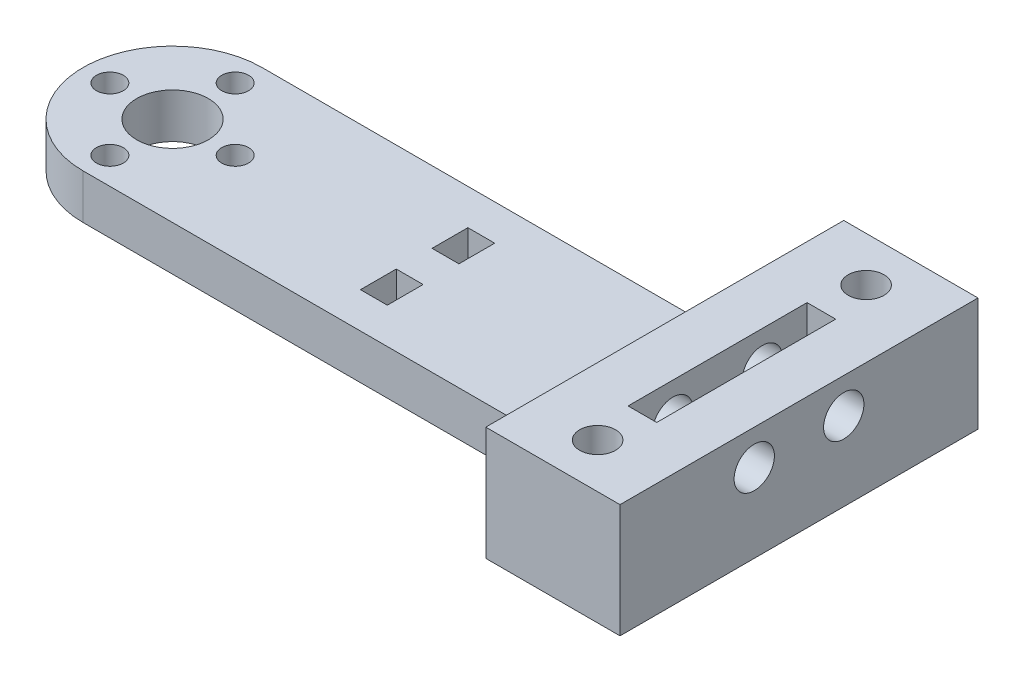
ISO-10303-21;
HEADER;
FILE_DESCRIPTION(('STEP AP214'),'2;1');
FILE_NAME('part.step','',(''),(''),'','','');
FILE_SCHEMA(('AUTOMOTIVE_DESIGN { 1 0 10303 214 1 1 1 1 }'));
ENDSEC;
DATA;
#1=APPLICATION_CONTEXT('core data for automotive mechanical design processes');
#2=APPLICATION_PROTOCOL_DEFINITION('international standard','automotive_design',2000,#1);
#3=PRODUCT_CONTEXT('',#1,'mechanical');
#4=PRODUCT('Part','Part','',(#3));
#5=PRODUCT_RELATED_PRODUCT_CATEGORY('part','',(#4));
#6=PRODUCT_DEFINITION_FORMATION('','',#4);
#7=PRODUCT_DEFINITION_CONTEXT('part definition',#1,'design');
#8=PRODUCT_DEFINITION('design','',#6,#7);
#9=PRODUCT_DEFINITION_SHAPE('','',#8);
#10=(LENGTH_UNIT() NAMED_UNIT(*) SI_UNIT(.MILLI.,.METRE.));
#11=(NAMED_UNIT(*) PLANE_ANGLE_UNIT() SI_UNIT($,.RADIAN.));
#12=(NAMED_UNIT(*) SI_UNIT($,.STERADIAN.) SOLID_ANGLE_UNIT());
#13=UNCERTAINTY_MEASURE_WITH_UNIT(LENGTH_MEASURE(1.E-05),#10,'distance_accuracy_value','');
#14=(GEOMETRIC_REPRESENTATION_CONTEXT(3) GLOBAL_UNCERTAINTY_ASSIGNED_CONTEXT((#13)) GLOBAL_UNIT_ASSIGNED_CONTEXT((#10,
#11,#12)) REPRESENTATION_CONTEXT('',''));
#15=CARTESIAN_POINT('',(0.,0.,0.));
#16=DIRECTION('',(0.,0.,1.));
#17=DIRECTION('',(1.,0.,0.));
#18=AXIS2_PLACEMENT_3D('',#15,#16,#17);
#19=CARTESIAN_POINT('',(8.8000166979834,8.80000000000001,-15.));
#20=DIRECTION('',(1.,0.,0.));
#21=DIRECTION('',(0.,0.,-1.));
#22=AXIS2_PLACEMENT_3D('',#19,#20,#21);
#23=CYLINDRICAL_SURFACE('',#22,2.25);
#24=CARTESIAN_POINT('',(22.9000166979834,8.80000000000001,-15.));
#25=DIRECTION('',(1.,0.,0.));
#26=DIRECTION('',(0.,0.,-1.));
#27=AXIS2_PLACEMENT_3D('',#24,#25,#26);
#28=CIRCLE('',#27,2.25);
#29=CARTESIAN_POINT('',(22.9000166979834,8.80000000000001,-17.25));
#30=VERTEX_POINT('',#29);
#31=EDGE_CURVE('E226',#30,#30,#28,.F.);
#32=ORIENTED_EDGE('',*,*,#31,.T.);
#33=EDGE_LOOP('',(#32));
#34=FACE_BOUND('',#33,.T.);
#35=CARTESIAN_POINT('',(28.8000166979834,8.80000000000001,-15.));
#36=DIRECTION('',(1.,0.,0.));
#37=DIRECTION('',(0.,0.,1.));
#38=AXIS2_PLACEMENT_3D('',#35,#36,#37);
#39=CIRCLE('',#38,2.25);
#40=CARTESIAN_POINT('',(28.8000166979834,8.80000000000001,-12.75));
#41=VERTEX_POINT('',#40);
#42=EDGE_CURVE('E269',#41,#41,#39,.T.);
#43=ORIENTED_EDGE('',*,*,#42,.T.);
#44=EDGE_LOOP('',(#43));
#45=FACE_BOUND('',#44,.T.);
#46=ADVANCED_FACE('F43',(#34,#45),#23,.F.);
#47=CARTESIAN_POINT('',(8.8000166979834,8.8,-4.99999999999999));
#48=DIRECTION('',(1.,0.,0.));
#49=DIRECTION('',(0.,0.,-1.));
#50=AXIS2_PLACEMENT_3D('',#47,#48,#49);
#51=CYLINDRICAL_SURFACE('',#50,2.25);
#52=CARTESIAN_POINT('',(22.9000166979834,8.8,-4.99999999999999));
#53=DIRECTION('',(1.,0.,0.));
#54=DIRECTION('',(0.,0.,-1.));
#55=AXIS2_PLACEMENT_3D('',#52,#53,#54);
#56=CIRCLE('',#55,2.25);
#57=CARTESIAN_POINT('',(22.9000166979834,8.8,-7.24999999999999));
#58=VERTEX_POINT('',#57);
#59=EDGE_CURVE('E47',#58,#58,#56,.F.);
#60=ORIENTED_EDGE('',*,*,#59,.T.);
#61=EDGE_LOOP('',(#60));
#62=FACE_BOUND('',#61,.T.);
#63=CARTESIAN_POINT('',(28.8000166979834,8.8,-4.99999999999999));
#64=DIRECTION('',(1.,0.,0.));
#65=DIRECTION('',(0.,0.,-1.));
#66=AXIS2_PLACEMENT_3D('',#63,#64,#65);
#67=CIRCLE('',#66,2.25);
#68=CARTESIAN_POINT('',(28.8000166979834,8.8,-7.24999999999999));
#69=VERTEX_POINT('',#68);
#70=EDGE_CURVE('E274',#69,#69,#67,.T.);
#71=ORIENTED_EDGE('',*,*,#70,.T.);
#72=EDGE_LOOP('',(#71));
#73=FACE_BOUND('',#72,.T.);
#74=ADVANCED_FACE('F420',(#62,#73),#51,.F.);
#75=CARTESIAN_POINT('',(-41.1999833020166,5.,-10.));
#76=DIRECTION('',(0.,1.,0.));
#77=DIRECTION('',(0.,0.,1.));
#78=AXIS2_PLACEMENT_3D('',#75,#76,#77);
#79=PLANE('',#78);
#80=DIRECTION('',(0.,0.,1.));
#81=VECTOR('',#80,1.);
#82=CARTESIAN_POINT('',(13.8000166979834,5.,-20.));
#83=LINE('',#82,#81);
#84=CARTESIAN_POINT('',(13.8000166979834,5.,-20.));
#85=VERTEX_POINT('',#84);
#86=CARTESIAN_POINT('',(13.8000166979834,5.,0.));
#87=VERTEX_POINT('',#86);
#88=EDGE_CURVE('E283',#85,#87,#83,.T.);
#89=ORIENTED_EDGE('',*,*,#88,.F.);
#90=DIRECTION('',(-1.,0.,0.));
#91=VECTOR('',#90,1.);
#92=CARTESIAN_POINT('',(-41.1999833020166,5.,-20.));
#93=LINE('',#92,#91);
#94=CARTESIAN_POINT('',(-41.1999833020166,5.,-20.));
#95=VERTEX_POINT('',#94);
#96=EDGE_CURVE('E387',#85,#95,#93,.T.);
#97=ORIENTED_EDGE('',*,*,#96,.T.);
#98=CARTESIAN_POINT('',(-41.1999833020166,5.,-10.));
#99=DIRECTION('',(0.,1.,0.));
#100=DIRECTION('',(0.,0.,1.));
#101=AXIS2_PLACEMENT_3D('',#98,#99,#100);
#102=CIRCLE('',#101,10.);
#103=CARTESIAN_POINT('',(-41.1999833020166,5.,0.));
#104=VERTEX_POINT('',#103);
#105=EDGE_CURVE('E380',#95,#104,#102,.T.);
#106=ORIENTED_EDGE('',*,*,#105,.T.);
#107=DIRECTION('',(1.,0.,0.));
#108=VECTOR('',#107,1.);
#109=CARTESIAN_POINT('',(-41.1999833020166,5.,0.));
#110=LINE('',#109,#108);
#111=EDGE_CURVE('E383',#104,#87,#110,.T.);
#112=ORIENTED_EDGE('',*,*,#111,.T.);
#113=EDGE_LOOP('',(#89,#97,#106,#112));
#114=FACE_BOUND('',#113,.T.);
#115=DIRECTION('',(1.,0.,0.));
#116=VECTOR('',#115,1.);
#117=CARTESIAN_POINT('',(-14.1999833020166,5.,-4.));
#118=LINE('',#117,#116);
#119=CARTESIAN_POINT('',(-14.1999833020166,5.,-4.));
#120=VERTEX_POINT('',#119);
#121=CARTESIAN_POINT('',(-11.1999833020166,5.,-4.));
#122=VERTEX_POINT('',#121);
#123=EDGE_CURVE('E305',#120,#122,#118,.T.);
#124=ORIENTED_EDGE('',*,*,#123,.F.);
#125=DIRECTION('',(0.,0.,1.));
#126=VECTOR('',#125,1.);
#127=CARTESIAN_POINT('',(-14.1999833020166,5.,-8.));
#128=LINE('',#127,#126);
#129=CARTESIAN_POINT('',(-14.1999833020166,5.,-8.));
#130=VERTEX_POINT('',#129);
#131=EDGE_CURVE('E330',#130,#120,#128,.T.);
#132=ORIENTED_EDGE('',*,*,#131,.F.);
#133=DIRECTION('',(1.,0.,0.));
#134=VECTOR('',#133,1.);
#135=CARTESIAN_POINT('',(-14.1999833020166,5.,-8.));
#136=LINE('',#135,#134);
#137=CARTESIAN_POINT('',(-11.1999833020166,5.,-8.));
#138=VERTEX_POINT('',#137);
#139=EDGE_CURVE('E333',#130,#138,#136,.T.);
#140=ORIENTED_EDGE('',*,*,#139,.T.);
#141=DIRECTION('',(0.,0.,1.));
#142=VECTOR('',#141,1.);
#143=CARTESIAN_POINT('',(-11.1999833020166,5.,-8.));
#144=LINE('',#143,#142);
#145=EDGE_CURVE('E337',#138,#122,#144,.T.);
#146=ORIENTED_EDGE('',*,*,#145,.T.);
#147=EDGE_LOOP('',(#124,#132,#140,#146));
#148=FACE_BOUND('',#147,.T.);
#149=CARTESIAN_POINT('',(-48.1999833020166,5.,-10.));
#150=DIRECTION('',(0.,1.,0.));
#151=DIRECTION('',(0.,0.,1.));
#152=AXIS2_PLACEMENT_3D('',#149,#150,#151);
#153=CIRCLE('',#152,1.5);
#154=CARTESIAN_POINT('',(-48.1999833020166,5.,-8.50000000000002));
#155=VERTEX_POINT('',#154);
#156=EDGE_CURVE('E354',#155,#155,#153,.T.);
#157=ORIENTED_EDGE('',*,*,#156,.F.);
#158=EDGE_LOOP('',(#157));
#159=FACE_BOUND('',#158,.T.);
#160=CARTESIAN_POINT('',(-41.1999833020166,5.,-10.));
#161=DIRECTION('',(0.,1.,0.));
#162=DIRECTION('',(0.,0.,1.));
#163=AXIS2_PLACEMENT_3D('',#160,#161,#162);
#164=CIRCLE('',#163,4.00000000000001);
#165=CARTESIAN_POINT('',(-41.1999833020166,5.,-5.99999999999999));
#166=VERTEX_POINT('',#165);
#167=EDGE_CURVE('E365',#166,#166,#164,.T.);
#168=ORIENTED_EDGE('',*,*,#167,.F.);
#169=EDGE_LOOP('',(#168));
#170=FACE_BOUND('',#169,.T.);
#171=CARTESIAN_POINT('',(-41.1999833020166,5.,-3.));
#172=DIRECTION('',(0.,1.,0.));
#173=DIRECTION('',(0.,0.,1.));
#174=AXIS2_PLACEMENT_3D('',#171,#172,#173);
#175=CIRCLE('',#174,1.5);
#176=CARTESIAN_POINT('',(-41.1999833020166,5.,-1.5));
#177=VERTEX_POINT('',#176);
#178=EDGE_CURVE('E358',#177,#177,#175,.T.);
#179=ORIENTED_EDGE('',*,*,#178,.F.);
#180=EDGE_LOOP('',(#179));
#181=FACE_BOUND('',#180,.T.);
#182=CARTESIAN_POINT('',(-34.1999833020166,5.,-9.99999999999994));
#183=DIRECTION('',(0.,1.,0.));
#184=DIRECTION('',(0.,0.,1.));
#185=AXIS2_PLACEMENT_3D('',#182,#183,#184);
#186=CIRCLE('',#185,1.5);
#187=CARTESIAN_POINT('',(-34.1999833020166,5.,-8.49999999999994));
#188=VERTEX_POINT('',#187);
#189=EDGE_CURVE('E375',#188,#188,#186,.T.);
#190=ORIENTED_EDGE('',*,*,#189,.F.);
#191=EDGE_LOOP('',(#190));
#192=FACE_BOUND('',#191,.T.);
#193=CARTESIAN_POINT('',(-41.1999833020166,5.,-17.));
#194=DIRECTION('',(0.,1.,0.));
#195=DIRECTION('',(0.,0.,1.));
#196=AXIS2_PLACEMENT_3D('',#193,#194,#195);
#197=CIRCLE('',#196,1.5);
#198=CARTESIAN_POINT('',(-41.1999833020166,5.,-15.5));
#199=VERTEX_POINT('',#198);
#200=EDGE_CURVE('E357',#199,#199,#197,.T.);
#201=ORIENTED_EDGE('',*,*,#200,.F.);
#202=EDGE_LOOP('',(#201));
#203=FACE_BOUND('',#202,.T.);
#204=DIRECTION('',(0.,0.,-1.));
#205=VECTOR('',#204,1.);
#206=CARTESIAN_POINT('',(-14.1999833020166,5.,-12.));
#207=LINE('',#206,#205);
#208=CARTESIAN_POINT('',(-14.1999833020166,5.,-12.));
#209=VERTEX_POINT('',#208);
#210=CARTESIAN_POINT('',(-14.1999833020166,5.,-16.));
#211=VERTEX_POINT('',#210);
#212=EDGE_CURVE('E294',#209,#211,#207,.T.);
#213=ORIENTED_EDGE('',*,*,#212,.T.);
#214=DIRECTION('',(1.,0.,0.));
#215=VECTOR('',#214,1.);
#216=CARTESIAN_POINT('',(-14.1999833020166,5.,-16.));
#217=LINE('',#216,#215);
#218=CARTESIAN_POINT('',(-11.1999833020166,5.,-16.));
#219=VERTEX_POINT('',#218);
#220=EDGE_CURVE('E68',#211,#219,#217,.T.);
#221=ORIENTED_EDGE('',*,*,#220,.T.);
#222=DIRECTION('',(0.,0.,-1.));
#223=VECTOR('',#222,1.);
#224=CARTESIAN_POINT('',(-11.1999833020166,5.,-12.));
#225=LINE('',#224,#223);
#226=CARTESIAN_POINT('',(-11.1999833020166,5.,-12.));
#227=VERTEX_POINT('',#226);
#228=EDGE_CURVE('E304',#227,#219,#225,.T.);
#229=ORIENTED_EDGE('',*,*,#228,.F.);
#230=DIRECTION('',(1.,0.,0.));
#231=VECTOR('',#230,1.);
#232=CARTESIAN_POINT('',(-14.1999833020166,5.,-12.));
#233=LINE('',#232,#231);
#234=EDGE_CURVE('E308',#209,#227,#233,.T.);
#235=ORIENTED_EDGE('',*,*,#234,.F.);
#236=EDGE_LOOP('',(#213,#221,#229,#235));
#237=FACE_BOUND('',#236,.T.);
#238=ADVANCED_FACE('F428',(#114,#148,#159,#170,#181,#192,#203,#237),#79,.T.);
#239=CARTESIAN_POINT('',(-41.1999833020166,0.,-10.));
#240=DIRECTION('',(0.,1.,0.));
#241=DIRECTION('',(0.,0.,1.));
#242=AXIS2_PLACEMENT_3D('',#239,#240,#241);
#243=PLANE('',#242);
#244=DIRECTION('',(-1.,0.,0.));
#245=VECTOR('',#244,1.);
#246=CARTESIAN_POINT('',(-41.1999833020166,0.,-20.));
#247=LINE('',#246,#245);
#248=CARTESIAN_POINT('',(13.8000166979834,0.,-20.));
#249=VERTEX_POINT('',#248);
#250=CARTESIAN_POINT('',(-41.1999833020166,0.,-20.));
#251=VERTEX_POINT('',#250);
#252=EDGE_CURVE('E384',#249,#251,#247,.T.);
#253=ORIENTED_EDGE('',*,*,#252,.F.);
#254=DIRECTION('',(0.,0.,1.));
#255=VECTOR('',#254,1.);
#256=CARTESIAN_POINT('',(13.8000166979834,0.,0.));
#257=LINE('',#256,#255);
#258=CARTESIAN_POINT('',(13.8000166979834,0.,-30.));
#259=VERTEX_POINT('',#258);
#260=EDGE_CURVE('E255',#259,#249,#257,.T.);
#261=ORIENTED_EDGE('',*,*,#260,.F.);
#262=DIRECTION('',(-1.,0.,0.));
#263=VECTOR('',#262,1.);
#264=CARTESIAN_POINT('',(0.,0.,-30.));
#265=LINE('',#264,#263);
#266=CARTESIAN_POINT('',(28.8000166979834,0.,-30.));
#267=VERTEX_POINT('',#266);
#268=EDGE_CURVE('E252',#267,#259,#265,.T.);
#269=ORIENTED_EDGE('',*,*,#268,.F.);
#270=DIRECTION('',(0.,0.,1.));
#271=VECTOR('',#270,1.);
#272=CARTESIAN_POINT('',(28.8000166979834,0.,-10.));
#273=LINE('',#272,#271);
#274=CARTESIAN_POINT('',(28.8000166979834,0.,10.));
#275=VERTEX_POINT('',#274);
#276=EDGE_CURVE('E285',#267,#275,#273,.T.);
#277=ORIENTED_EDGE('',*,*,#276,.T.);
#278=DIRECTION('',(-1.,0.,0.));
#279=VECTOR('',#278,1.);
#280=CARTESIAN_POINT('',(0.,0.,10.));
#281=LINE('',#280,#279);
#282=CARTESIAN_POINT('',(13.8000166979834,0.,10.));
#283=VERTEX_POINT('',#282);
#284=EDGE_CURVE('E237',#275,#283,#281,.T.);
#285=ORIENTED_EDGE('',*,*,#284,.T.);
#286=DIRECTION('',(0.,0.,1.));
#287=VECTOR('',#286,1.);
#288=CARTESIAN_POINT('',(13.8000166979834,0.,0.));
#289=LINE('',#288,#287);
#290=CARTESIAN_POINT('',(13.8000166979834,0.,0.));
#291=VERTEX_POINT('',#290);
#292=EDGE_CURVE('E233',#291,#283,#289,.T.);
#293=ORIENTED_EDGE('',*,*,#292,.F.);
#294=DIRECTION('',(1.,0.,0.));
#295=VECTOR('',#294,1.);
#296=CARTESIAN_POINT('',(-41.1999833020166,0.,0.));
#297=LINE('',#296,#295);
#298=CARTESIAN_POINT('',(-41.1999833020166,0.,0.));
#299=VERTEX_POINT('',#298);
#300=EDGE_CURVE('E391',#299,#291,#297,.T.);
#301=ORIENTED_EDGE('',*,*,#300,.F.);
#302=CARTESIAN_POINT('',(-41.1999833020166,0.,-10.));
#303=DIRECTION('',(0.,1.,0.));
#304=DIRECTION('',(0.,0.,1.));
#305=AXIS2_PLACEMENT_3D('',#302,#303,#304);
#306=CIRCLE('',#305,10.);
#307=EDGE_CURVE('E353',#251,#299,#306,.T.);
#308=ORIENTED_EDGE('',*,*,#307,.F.);
#309=EDGE_LOOP('',(#253,#261,#269,#277,#285,#293,#301,#308));
#310=FACE_BOUND('',#309,.T.);
#311=CARTESIAN_POINT('',(-41.1999833020166,0.,-17.));
#312=DIRECTION('',(0.,1.,0.));
#313=DIRECTION('',(0.,0.,1.));
#314=AXIS2_PLACEMENT_3D('',#311,#312,#313);
#315=CIRCLE('',#314,1.5);
#316=CARTESIAN_POINT('',(-41.1999833020166,0.,-15.5));
#317=VERTEX_POINT('',#316);
#318=EDGE_CURVE('E372',#317,#317,#315,.T.);
#319=ORIENTED_EDGE('',*,*,#318,.T.);
#320=EDGE_LOOP('',(#319));
#321=FACE_BOUND('',#320,.T.);
#322=CARTESIAN_POINT('',(-34.1999833020166,0.,-9.99999999999994));
#323=DIRECTION('',(0.,1.,0.));
#324=DIRECTION('',(0.,0.,1.));
#325=AXIS2_PLACEMENT_3D('',#322,#323,#324);
#326=CIRCLE('',#325,1.5);
#327=CARTESIAN_POINT('',(-34.1999833020166,0.,-8.49999999999994));
#328=VERTEX_POINT('',#327);
#329=EDGE_CURVE('E361',#328,#328,#326,.T.);
#330=ORIENTED_EDGE('',*,*,#329,.T.);
#331=EDGE_LOOP('',(#330));
#332=FACE_BOUND('',#331,.T.);
#333=CARTESIAN_POINT('',(-41.1999833020166,0.,-3.));
#334=DIRECTION('',(0.,1.,0.));
#335=DIRECTION('',(0.,0.,1.));
#336=AXIS2_PLACEMENT_3D('',#333,#334,#335);
#337=CIRCLE('',#336,1.5);
#338=CARTESIAN_POINT('',(-41.1999833020166,0.,-1.5));
#339=VERTEX_POINT('',#338);
#340=EDGE_CURVE('E362',#339,#339,#337,.T.);
#341=ORIENTED_EDGE('',*,*,#340,.T.);
#342=EDGE_LOOP('',(#341));
#343=FACE_BOUND('',#342,.T.);
#344=CARTESIAN_POINT('',(-41.1999833020166,0.,-10.));
#345=DIRECTION('',(0.,1.,0.));
#346=DIRECTION('',(0.,0.,1.));
#347=AXIS2_PLACEMENT_3D('',#344,#345,#346);
#348=CIRCLE('',#347,4.00000000000001);
#349=CARTESIAN_POINT('',(-41.1999833020166,0.,-5.99999999999999));
#350=VERTEX_POINT('',#349);
#351=EDGE_CURVE('E320',#350,#350,#348,.T.);
#352=ORIENTED_EDGE('',*,*,#351,.T.);
#353=EDGE_LOOP('',(#352));
#354=FACE_BOUND('',#353,.T.);
#355=CARTESIAN_POINT('',(-48.1999833020166,0.,-10.));
#356=DIRECTION('',(0.,1.,0.));
#357=DIRECTION('',(0.,0.,1.));
#358=AXIS2_PLACEMENT_3D('',#355,#356,#357);
#359=CIRCLE('',#358,1.5);
#360=CARTESIAN_POINT('',(-48.1999833020166,0.,-8.50000000000002));
#361=VERTEX_POINT('',#360);
#362=EDGE_CURVE('E350',#361,#361,#359,.T.);
#363=ORIENTED_EDGE('',*,*,#362,.T.);
#364=EDGE_LOOP('',(#363));
#365=FACE_BOUND('',#364,.T.);
#366=DIRECTION('',(0.,0.,1.));
#367=VECTOR('',#366,1.);
#368=CARTESIAN_POINT('',(-14.1999833020166,0.,-8.));
#369=LINE('',#368,#367);
#370=CARTESIAN_POINT('',(-14.1999833020166,0.,-8.));
#371=VERTEX_POINT('',#370);
#372=CARTESIAN_POINT('',(-14.1999833020166,0.,-4.));
#373=VERTEX_POINT('',#372);
#374=EDGE_CURVE('E324',#371,#373,#369,.T.);
#375=ORIENTED_EDGE('',*,*,#374,.T.);
#376=DIRECTION('',(1.,0.,0.));
#377=VECTOR('',#376,1.);
#378=CARTESIAN_POINT('',(-14.1999833020166,0.,-4.));
#379=LINE('',#378,#377);
#380=CARTESIAN_POINT('',(-11.1999833020166,0.,-4.));
#381=VERTEX_POINT('',#380);
#382=EDGE_CURVE('E334',#373,#381,#379,.T.);
#383=ORIENTED_EDGE('',*,*,#382,.T.);
#384=DIRECTION('',(0.,0.,1.));
#385=VECTOR('',#384,1.);
#386=CARTESIAN_POINT('',(-11.1999833020166,0.,-8.));
#387=LINE('',#386,#385);
#388=CARTESIAN_POINT('',(-11.1999833020166,0.,-8.));
#389=VERTEX_POINT('',#388);
#390=EDGE_CURVE('E346',#389,#381,#387,.T.);
#391=ORIENTED_EDGE('',*,*,#390,.F.);
#392=DIRECTION('',(1.,0.,0.));
#393=VECTOR('',#392,1.);
#394=CARTESIAN_POINT('',(-14.1999833020166,0.,-8.));
#395=LINE('',#394,#393);
#396=EDGE_CURVE('E343',#371,#389,#395,.T.);
#397=ORIENTED_EDGE('',*,*,#396,.F.);
#398=EDGE_LOOP('',(#375,#383,#391,#397));
#399=FACE_BOUND('',#398,.T.);
#400=DIRECTION('',(1.,0.,0.));
#401=VECTOR('',#400,1.);
#402=CARTESIAN_POINT('',(-14.1999833020166,0.,-16.));
#403=LINE('',#402,#401);
#404=CARTESIAN_POINT('',(-14.1999833020166,0.,-16.));
#405=VERTEX_POINT('',#404);
#406=CARTESIAN_POINT('',(-11.1999833020166,0.,-16.));
#407=VERTEX_POINT('',#406);
#408=EDGE_CURVE('E291',#405,#407,#403,.T.);
#409=ORIENTED_EDGE('',*,*,#408,.F.);
#410=DIRECTION('',(0.,0.,-1.));
#411=VECTOR('',#410,1.);
#412=CARTESIAN_POINT('',(-14.1999833020166,0.,-12.));
#413=LINE('',#412,#411);
#414=CARTESIAN_POINT('',(-14.1999833020166,0.,-12.));
#415=VERTEX_POINT('',#414);
#416=EDGE_CURVE('E300',#415,#405,#413,.T.);
#417=ORIENTED_EDGE('',*,*,#416,.F.);
#418=DIRECTION('',(1.,0.,0.));
#419=VECTOR('',#418,1.);
#420=CARTESIAN_POINT('',(-14.1999833020166,0.,-12.));
#421=LINE('',#420,#419);
#422=CARTESIAN_POINT('',(-11.1999833020166,0.,-12.));
#423=VERTEX_POINT('',#422);
#424=EDGE_CURVE('E297',#415,#423,#421,.T.);
#425=ORIENTED_EDGE('',*,*,#424,.T.);
#426=DIRECTION('',(0.,0.,-1.));
#427=VECTOR('',#426,1.);
#428=CARTESIAN_POINT('',(-11.1999833020166,0.,-12.));
#429=LINE('',#428,#427);
#430=EDGE_CURVE('E293',#423,#407,#429,.T.);
#431=ORIENTED_EDGE('',*,*,#430,.T.);
#432=EDGE_LOOP('',(#409,#417,#425,#431));
#433=FACE_BOUND('',#432,.T.);
#434=CARTESIAN_POINT('',(21.3000166979834,0.,-25.));
#435=DIRECTION('',(0.,1.,0.));
#436=DIRECTION('',(0.,0.,1.));
#437=AXIS2_PLACEMENT_3D('',#434,#435,#436);
#438=CIRCLE('',#437,2.);
#439=CARTESIAN_POINT('',(21.3000166979834,0.,-23.));
#440=VERTEX_POINT('',#439);
#441=EDGE_CURVE('E258',#440,#440,#438,.F.);
#442=ORIENTED_EDGE('',*,*,#441,.F.);
#443=EDGE_LOOP('',(#442));
#444=FACE_BOUND('',#443,.T.);
#445=CARTESIAN_POINT('',(21.3000166979834,0.,5.));
#446=DIRECTION('',(0.,1.,0.));
#447=DIRECTION('',(0.,0.,1.));
#448=AXIS2_PLACEMENT_3D('',#445,#446,#447);
#449=CIRCLE('',#448,2.);
#450=CARTESIAN_POINT('',(21.3000166979834,0.,7.00000000000001));
#451=VERTEX_POINT('',#450);
#452=EDGE_CURVE('E230',#451,#451,#449,.T.);
#453=ORIENTED_EDGE('',*,*,#452,.T.);
#454=EDGE_LOOP('',(#453));
#455=FACE_BOUND('',#454,.T.);
#456=ADVANCED_FACE('F469',(#310,#321,#332,#343,#354,#365,#399,#433,#444,#455),#243,.F.);
#457=CARTESIAN_POINT('',(-41.1999833020166,5.,-10.));
#458=DIRECTION('',(0.,-1.,0.));
#459=DIRECTION('',(0.,0.,-1.));
#460=AXIS2_PLACEMENT_3D('',#457,#458,#459);
#461=CYLINDRICAL_SURFACE('',#460,10.);
#462=ORIENTED_EDGE('',*,*,#307,.T.);
#463=DIRECTION('',(0.,-1.,0.));
#464=VECTOR('',#463,1.);
#465=CARTESIAN_POINT('',(-41.1999833020166,5.,0.));
#466=LINE('',#465,#464);
#467=EDGE_CURVE('E11',#104,#299,#466,.T.);
#468=ORIENTED_EDGE('',*,*,#467,.F.);
#469=ORIENTED_EDGE('',*,*,#105,.F.);
#470=DIRECTION('',(0.,-1.,0.));
#471=VECTOR('',#470,1.);
#472=CARTESIAN_POINT('',(-41.1999833020166,5.,-20.));
#473=LINE('',#472,#471);
#474=EDGE_CURVE('E52',#95,#251,#473,.T.);
#475=ORIENTED_EDGE('',*,*,#474,.T.);
#476=EDGE_LOOP('',(#462,#468,#469,#475));
#477=FACE_BOUND('',#476,.T.);
#478=ADVANCED_FACE('F45',(#477),#461,.T.);
#479=CARTESIAN_POINT('',(-41.1999833020166,5.,0.));
#480=DIRECTION('',(0.,0.,-1.));
#481=DIRECTION('',(-1.,0.,0.));
#482=AXIS2_PLACEMENT_3D('',#479,#480,#481);
#483=PLANE('',#482);
#484=ORIENTED_EDGE('',*,*,#300,.T.);
#485=DIRECTION('',(0.,1.,0.));
#486=VECTOR('',#485,1.);
#487=CARTESIAN_POINT('',(13.8000166979834,0.,0.));
#488=LINE('',#487,#486);
#489=EDGE_CURVE('E239',#291,#87,#488,.T.);
#490=ORIENTED_EDGE('',*,*,#489,.T.);
#491=ORIENTED_EDGE('',*,*,#111,.F.);
#492=ORIENTED_EDGE('',*,*,#467,.T.);
#493=EDGE_LOOP('',(#484,#490,#491,#492));
#494=FACE_BOUND('',#493,.T.);
#495=ADVANCED_FACE('F467',(#494),#483,.F.);
#496=CARTESIAN_POINT('',(-41.1999833020166,5.,-20.));
#497=DIRECTION('',(0.,0.,1.));
#498=DIRECTION('',(1.,0.,0.));
#499=AXIS2_PLACEMENT_3D('',#496,#497,#498);
#500=PLANE('',#499);
#501=ORIENTED_EDGE('',*,*,#96,.F.);
#502=DIRECTION('',(0.,1.,0.));
#503=VECTOR('',#502,1.);
#504=CARTESIAN_POINT('',(13.8000166979834,0.,-20.));
#505=LINE('',#504,#503);
#506=EDGE_CURVE('E270',#249,#85,#505,.T.);
#507=ORIENTED_EDGE('',*,*,#506,.F.);
#508=ORIENTED_EDGE('',*,*,#252,.T.);
#509=ORIENTED_EDGE('',*,*,#474,.F.);
#510=EDGE_LOOP('',(#501,#507,#508,#509));
#511=FACE_BOUND('',#510,.T.);
#512=ADVANCED_FACE('F460',(#511),#500,.F.);
#513=CARTESIAN_POINT('',(-41.1999833020166,0.,-17.));
#514=DIRECTION('',(0.,1.,0.));
#515=DIRECTION('',(0.,0.,1.));
#516=AXIS2_PLACEMENT_3D('',#513,#514,#515);
#517=CYLINDRICAL_SURFACE('',#516,1.5);
#518=ORIENTED_EDGE('',*,*,#318,.F.);
#519=EDGE_LOOP('',(#518));
#520=FACE_BOUND('',#519,.T.);
#521=ORIENTED_EDGE('',*,*,#200,.T.);
#522=EDGE_LOOP('',(#521));
#523=FACE_BOUND('',#522,.T.);
#524=ADVANCED_FACE('F537',(#520,#523),#517,.F.);
#525=CARTESIAN_POINT('',(-34.1999833020166,0.,-9.99999999999994));
#526=DIRECTION('',(0.,1.,0.));
#527=DIRECTION('',(0.,0.,1.));
#528=AXIS2_PLACEMENT_3D('',#525,#526,#527);
#529=CYLINDRICAL_SURFACE('',#528,1.5);
#530=ORIENTED_EDGE('',*,*,#329,.F.);
#531=EDGE_LOOP('',(#530));
#532=FACE_BOUND('',#531,.T.);
#533=ORIENTED_EDGE('',*,*,#189,.T.);
#534=EDGE_LOOP('',(#533));
#535=FACE_BOUND('',#534,.T.);
#536=ADVANCED_FACE('F532',(#532,#535),#529,.F.);
#537=CARTESIAN_POINT('',(-41.1999833020166,0.,-3.));
#538=DIRECTION('',(0.,1.,0.));
#539=DIRECTION('',(0.,0.,1.));
#540=AXIS2_PLACEMENT_3D('',#537,#538,#539);
#541=CYLINDRICAL_SURFACE('',#540,1.5);
#542=ORIENTED_EDGE('',*,*,#340,.F.);
#543=EDGE_LOOP('',(#542));
#544=FACE_BOUND('',#543,.T.);
#545=ORIENTED_EDGE('',*,*,#178,.T.);
#546=EDGE_LOOP('',(#545));
#547=FACE_BOUND('',#546,.T.);
#548=ADVANCED_FACE('F529',(#544,#547),#541,.F.);
#549=CARTESIAN_POINT('',(-41.1999833020166,0.,-10.));
#550=DIRECTION('',(0.,1.,0.));
#551=DIRECTION('',(0.,0.,1.));
#552=AXIS2_PLACEMENT_3D('',#549,#550,#551);
#553=CYLINDRICAL_SURFACE('',#552,4.00000000000001);
#554=ORIENTED_EDGE('',*,*,#351,.F.);
#555=EDGE_LOOP('',(#554));
#556=FACE_BOUND('',#555,.T.);
#557=ORIENTED_EDGE('',*,*,#167,.T.);
#558=EDGE_LOOP('',(#557));
#559=FACE_BOUND('',#558,.T.);
#560=ADVANCED_FACE('F527',(#556,#559),#553,.F.);
#561=CARTESIAN_POINT('',(-48.1999833020166,0.,-10.));
#562=DIRECTION('',(0.,1.,0.));
#563=DIRECTION('',(0.,0.,1.));
#564=AXIS2_PLACEMENT_3D('',#561,#562,#563);
#565=CYLINDRICAL_SURFACE('',#564,1.5);
#566=ORIENTED_EDGE('',*,*,#362,.F.);
#567=EDGE_LOOP('',(#566));
#568=FACE_BOUND('',#567,.T.);
#569=ORIENTED_EDGE('',*,*,#156,.T.);
#570=EDGE_LOOP('',(#569));
#571=FACE_BOUND('',#570,.T.);
#572=ADVANCED_FACE('F513',(#568,#571),#565,.F.);
#573=CARTESIAN_POINT('',(-14.1999833020166,0.,-4.));
#574=DIRECTION('',(0.,0.,1.));
#575=DIRECTION('',(1.,0.,0.));
#576=AXIS2_PLACEMENT_3D('',#573,#574,#575);
#577=PLANE('',#576);
#578=ORIENTED_EDGE('',*,*,#123,.T.);
#579=DIRECTION('',(0.,1.,0.));
#580=VECTOR('',#579,1.);
#581=CARTESIAN_POINT('',(-11.1999833020166,0.,-4.));
#582=LINE('',#581,#580);
#583=EDGE_CURVE('E321',#381,#122,#582,.T.);
#584=ORIENTED_EDGE('',*,*,#583,.F.);
#585=ORIENTED_EDGE('',*,*,#382,.F.);
#586=DIRECTION('',(0.,1.,0.));
#587=VECTOR('',#586,1.);
#588=CARTESIAN_POINT('',(-14.1999833020166,0.,-4.));
#589=LINE('',#588,#587);
#590=EDGE_CURVE('E290',#373,#120,#589,.T.);
#591=ORIENTED_EDGE('',*,*,#590,.T.);
#592=EDGE_LOOP('',(#578,#584,#585,#591));
#593=FACE_BOUND('',#592,.T.);
#594=ADVANCED_FACE('F509',(#593),#577,.F.);
#595=CARTESIAN_POINT('',(-14.1999833020166,0.,-8.));
#596=DIRECTION('',(-1.,0.,0.));
#597=DIRECTION('',(0.,0.,1.));
#598=AXIS2_PLACEMENT_3D('',#595,#596,#597);
#599=PLANE('',#598);
#600=ORIENTED_EDGE('',*,*,#131,.T.);
#601=ORIENTED_EDGE('',*,*,#590,.F.);
#602=ORIENTED_EDGE('',*,*,#374,.F.);
#603=DIRECTION('',(0.,1.,0.));
#604=VECTOR('',#603,1.);
#605=CARTESIAN_POINT('',(-14.1999833020166,0.,-8.));
#606=LINE('',#605,#604);
#607=EDGE_CURVE('E327',#371,#130,#606,.T.);
#608=ORIENTED_EDGE('',*,*,#607,.T.);
#609=EDGE_LOOP('',(#600,#601,#602,#608));
#610=FACE_BOUND('',#609,.T.);
#611=ADVANCED_FACE('F512',(#610),#599,.F.);
#612=CARTESIAN_POINT('',(-14.1999833020166,0.,-8.));
#613=DIRECTION('',(0.,0.,1.));
#614=DIRECTION('',(1.,0.,0.));
#615=AXIS2_PLACEMENT_3D('',#612,#613,#614);
#616=PLANE('',#615);
#617=ORIENTED_EDGE('',*,*,#139,.F.);
#618=ORIENTED_EDGE('',*,*,#607,.F.);
#619=ORIENTED_EDGE('',*,*,#396,.T.);
#620=DIRECTION('',(0.,1.,0.));
#621=VECTOR('',#620,1.);
#622=CARTESIAN_POINT('',(-11.1999833020166,0.,-8.));
#623=LINE('',#622,#621);
#624=EDGE_CURVE('E325',#389,#138,#623,.T.);
#625=ORIENTED_EDGE('',*,*,#624,.T.);
#626=EDGE_LOOP('',(#617,#618,#619,#625));
#627=FACE_BOUND('',#626,.T.);
#628=ADVANCED_FACE('F517',(#627),#616,.T.);
#629=CARTESIAN_POINT('',(-11.1999833020166,0.,-8.));
#630=DIRECTION('',(-1.,0.,0.));
#631=DIRECTION('',(0.,0.,1.));
#632=AXIS2_PLACEMENT_3D('',#629,#630,#631);
#633=PLANE('',#632);
#634=ORIENTED_EDGE('',*,*,#145,.F.);
#635=ORIENTED_EDGE('',*,*,#624,.F.);
#636=ORIENTED_EDGE('',*,*,#390,.T.);
#637=ORIENTED_EDGE('',*,*,#583,.T.);
#638=EDGE_LOOP('',(#634,#635,#636,#637));
#639=FACE_BOUND('',#638,.T.);
#640=ADVANCED_FACE('F508',(#639),#633,.T.);
#641=CARTESIAN_POINT('',(-14.1999833020166,0.,-16.));
#642=DIRECTION('',(0.,0.,1.));
#643=DIRECTION('',(1.,0.,0.));
#644=AXIS2_PLACEMENT_3D('',#641,#642,#643);
#645=PLANE('',#644);
#646=ORIENTED_EDGE('',*,*,#220,.F.);
#647=DIRECTION('',(0.,1.,0.));
#648=VECTOR('',#647,1.);
#649=CARTESIAN_POINT('',(-14.1999833020166,0.,-16.));
#650=LINE('',#649,#648);
#651=EDGE_CURVE('E302',#405,#211,#650,.T.);
#652=ORIENTED_EDGE('',*,*,#651,.F.);
#653=ORIENTED_EDGE('',*,*,#408,.T.);
#654=DIRECTION('',(0.,1.,0.));
#655=VECTOR('',#654,1.);
#656=CARTESIAN_POINT('',(-11.1999833020166,0.,-16.));
#657=LINE('',#656,#655);
#658=EDGE_CURVE('E318',#407,#219,#657,.T.);
#659=ORIENTED_EDGE('',*,*,#658,.T.);
#660=EDGE_LOOP('',(#646,#652,#653,#659));
#661=FACE_BOUND('',#660,.T.);
#662=ADVANCED_FACE('F504',(#661),#645,.T.);
#663=CARTESIAN_POINT('',(-11.1999833020166,0.,-12.));
#664=DIRECTION('',(1.,0.,0.));
#665=DIRECTION('',(0.,0.,-1.));
#666=AXIS2_PLACEMENT_3D('',#663,#664,#665);
#667=PLANE('',#666);
#668=ORIENTED_EDGE('',*,*,#228,.T.);
#669=ORIENTED_EDGE('',*,*,#658,.F.);
#670=ORIENTED_EDGE('',*,*,#430,.F.);
#671=DIRECTION('',(0.,1.,0.));
#672=VECTOR('',#671,1.);
#673=CARTESIAN_POINT('',(-11.1999833020166,0.,-12.));
#674=LINE('',#673,#672);
#675=EDGE_CURVE('E316',#423,#227,#674,.T.);
#676=ORIENTED_EDGE('',*,*,#675,.T.);
#677=EDGE_LOOP('',(#668,#669,#670,#676));
#678=FACE_BOUND('',#677,.T.);
#679=ADVANCED_FACE('F500',(#678),#667,.F.);
#680=CARTESIAN_POINT('',(-14.1999833020166,0.,-12.));
#681=DIRECTION('',(0.,0.,1.));
#682=DIRECTION('',(1.,0.,0.));
#683=AXIS2_PLACEMENT_3D('',#680,#681,#682);
#684=PLANE('',#683);
#685=ORIENTED_EDGE('',*,*,#234,.T.);
#686=ORIENTED_EDGE('',*,*,#675,.F.);
#687=ORIENTED_EDGE('',*,*,#424,.F.);
#688=DIRECTION('',(0.,1.,0.));
#689=VECTOR('',#688,1.);
#690=CARTESIAN_POINT('',(-14.1999833020166,0.,-12.));
#691=LINE('',#690,#689);
#692=EDGE_CURVE('E314',#415,#209,#691,.T.);
#693=ORIENTED_EDGE('',*,*,#692,.T.);
#694=EDGE_LOOP('',(#685,#686,#687,#693));
#695=FACE_BOUND('',#694,.T.);
#696=ADVANCED_FACE('F492',(#695),#684,.F.);
#697=CARTESIAN_POINT('',(-14.1999833020166,0.,-12.));
#698=DIRECTION('',(1.,0.,0.));
#699=DIRECTION('',(0.,0.,-1.));
#700=AXIS2_PLACEMENT_3D('',#697,#698,#699);
#701=PLANE('',#700);
#702=ORIENTED_EDGE('',*,*,#212,.F.);
#703=ORIENTED_EDGE('',*,*,#692,.F.);
#704=ORIENTED_EDGE('',*,*,#416,.T.);
#705=ORIENTED_EDGE('',*,*,#651,.T.);
#706=EDGE_LOOP('',(#702,#703,#704,#705));
#707=FACE_BOUND('',#706,.T.);
#708=ADVANCED_FACE('F486',(#707),#701,.T.);
#709=CARTESIAN_POINT('',(28.8000166979834,-5.,-20.));
#710=DIRECTION('',(-1.,0.,0.));
#711=DIRECTION('',(0.,0.,1.));
#712=AXIS2_PLACEMENT_3D('',#709,#710,#711);
#713=PLANE('',#712);
#714=ORIENTED_EDGE('',*,*,#70,.F.);
#715=EDGE_LOOP('',(#714));
#716=FACE_BOUND('',#715,.T.);
#717=ORIENTED_EDGE('',*,*,#42,.F.);
#718=EDGE_LOOP('',(#717));
#719=FACE_BOUND('',#718,.T.);
#720=ORIENTED_EDGE('',*,*,#276,.F.);
#721=DIRECTION('',(0.,1.,0.));
#722=VECTOR('',#721,1.);
#723=CARTESIAN_POINT('',(28.8000166979834,0.,-30.));
#724=LINE('',#723,#722);
#725=CARTESIAN_POINT('',(28.8000166979834,12.7,-30.));
#726=VERTEX_POINT('',#725);
#727=EDGE_CURVE('E266',#267,#726,#724,.T.);
#728=ORIENTED_EDGE('',*,*,#727,.T.);
#729=DIRECTION('',(0.,0.,-1.));
#730=VECTOR('',#729,1.);
#731=CARTESIAN_POINT('',(28.8000166979834,12.7,-20.));
#732=LINE('',#731,#730);
#733=CARTESIAN_POINT('',(28.8000166979834,12.7,10.));
#734=VERTEX_POINT('',#733);
#735=EDGE_CURVE('E282',#734,#726,#732,.T.);
#736=ORIENTED_EDGE('',*,*,#735,.F.);
#737=DIRECTION('',(0.,1.,0.));
#738=VECTOR('',#737,1.);
#739=CARTESIAN_POINT('',(28.8000166979834,0.,10.));
#740=LINE('',#739,#738);
#741=EDGE_CURVE('E244',#275,#734,#740,.T.);
#742=ORIENTED_EDGE('',*,*,#741,.F.);
#743=EDGE_LOOP('',(#720,#728,#736,#742));
#744=FACE_BOUND('',#743,.T.);
#745=ADVANCED_FACE('F449',(#716,#719,#744),#713,.F.);
#746=CARTESIAN_POINT('',(13.8000166979834,12.7,-20.));
#747=DIRECTION('',(1.,0.,0.));
#748=DIRECTION('',(0.,0.,-1.));
#749=AXIS2_PLACEMENT_3D('',#746,#747,#748);
#750=PLANE('',#749);
#751=CARTESIAN_POINT('',(13.8000166979834,8.8,-4.99999999999999));
#752=DIRECTION('',(1.,0.,0.));
#753=DIRECTION('',(0.,0.,-1.));
#754=AXIS2_PLACEMENT_3D('',#751,#752,#753);
#755=CIRCLE('',#754,2.25);
#756=CARTESIAN_POINT('',(13.8000166979834,8.8,-7.24999999999999));
#757=VERTEX_POINT('',#756);
#758=EDGE_CURVE('E288',#757,#757,#755,.T.);
#759=ORIENTED_EDGE('',*,*,#758,.T.);
#760=EDGE_LOOP('',(#759));
#761=FACE_BOUND('',#760,.T.);
#762=CARTESIAN_POINT('',(13.8000166979834,8.80000000000001,-15.));
#763=DIRECTION('',(1.,0.,0.));
#764=DIRECTION('',(0.,0.,-1.));
#765=AXIS2_PLACEMENT_3D('',#762,#763,#764);
#766=CIRCLE('',#765,2.25);
#767=CARTESIAN_POINT('',(13.8000166979834,8.80000000000001,-17.25));
#768=VERTEX_POINT('',#767);
#769=EDGE_CURVE('E277',#768,#768,#766,.T.);
#770=ORIENTED_EDGE('',*,*,#769,.T.);
#771=EDGE_LOOP('',(#770));
#772=FACE_BOUND('',#771,.T.);
#773=ORIENTED_EDGE('',*,*,#88,.T.);
#774=ORIENTED_EDGE('',*,*,#489,.F.);
#775=ORIENTED_EDGE('',*,*,#292,.T.);
#776=DIRECTION('',(0.,1.,0.));
#777=VECTOR('',#776,1.);
#778=CARTESIAN_POINT('',(13.8000166979834,0.,10.));
#779=LINE('',#778,#777);
#780=CARTESIAN_POINT('',(13.8000166979834,12.7,10.));
#781=VERTEX_POINT('',#780);
#782=EDGE_CURVE('E248',#283,#781,#779,.T.);
#783=ORIENTED_EDGE('',*,*,#782,.T.);
#784=DIRECTION('',(0.,0.,1.));
#785=VECTOR('',#784,1.);
#786=CARTESIAN_POINT('',(13.8000166979834,12.7,-20.));
#787=LINE('',#786,#785);
#788=CARTESIAN_POINT('',(13.8000166979834,12.7,-30.));
#789=VERTEX_POINT('',#788);
#790=EDGE_CURVE('E280',#789,#781,#787,.T.);
#791=ORIENTED_EDGE('',*,*,#790,.F.);
#792=DIRECTION('',(0.,1.,0.));
#793=VECTOR('',#792,1.);
#794=CARTESIAN_POINT('',(13.8000166979834,0.,-30.));
#795=LINE('',#794,#793);
#796=EDGE_CURVE('E261',#259,#789,#795,.T.);
#797=ORIENTED_EDGE('',*,*,#796,.F.);
#798=ORIENTED_EDGE('',*,*,#260,.T.);
#799=ORIENTED_EDGE('',*,*,#506,.T.);
#800=EDGE_LOOP('',(#773,#774,#775,#783,#791,#797,#798,#799));
#801=FACE_BOUND('',#800,.T.);
#802=ADVANCED_FACE('F441',(#761,#772,#801),#750,.F.);
#803=CARTESIAN_POINT('',(0.,12.7,0.));
#804=DIRECTION('',(0.,1.,0.));
#805=DIRECTION('',(0.,0.,1.));
#806=AXIS2_PLACEMENT_3D('',#803,#804,#805);
#807=PLANE('',#806);
#808=DIRECTION('',(-1.,0.,0.));
#809=VECTOR('',#808,1.);
#810=CARTESIAN_POINT('',(22.9000166979834,12.7,-20.));
#811=LINE('',#810,#809);
#812=CARTESIAN_POINT('',(22.9000166979834,12.7,-20.));
#813=VERTEX_POINT('',#812);
#814=CARTESIAN_POINT('',(19.7000166979834,12.7,-20.));
#815=VERTEX_POINT('',#814);
#816=EDGE_CURVE('E60',#813,#815,#811,.T.);
#817=ORIENTED_EDGE('',*,*,#816,.F.);
#818=DIRECTION('',(0.,0.,-1.));
#819=VECTOR('',#818,1.);
#820=CARTESIAN_POINT('',(22.9000166979834,12.7,-20.));
#821=LINE('',#820,#819);
#822=CARTESIAN_POINT('',(22.9000166979834,12.7,0.));
#823=VERTEX_POINT('',#822);
#824=EDGE_CURVE('E204',#823,#813,#821,.T.);
#825=ORIENTED_EDGE('',*,*,#824,.F.);
#826=DIRECTION('',(1.,0.,0.));
#827=VECTOR('',#826,1.);
#828=CARTESIAN_POINT('',(22.9000166979834,12.7,0.));
#829=LINE('',#828,#827);
#830=CARTESIAN_POINT('',(19.7000166979834,12.7,0.));
#831=VERTEX_POINT('',#830);
#832=EDGE_CURVE('E207',#831,#823,#829,.T.);
#833=ORIENTED_EDGE('',*,*,#832,.F.);
#834=DIRECTION('',(0.,0.,1.));
#835=VECTOR('',#834,1.);
#836=CARTESIAN_POINT('',(19.7000166979834,12.7,-20.));
#837=LINE('',#836,#835);
#838=EDGE_CURVE('E213',#815,#831,#837,.T.);
#839=ORIENTED_EDGE('',*,*,#838,.F.);
#840=EDGE_LOOP('',(#817,#825,#833,#839));
#841=FACE_BOUND('',#840,.T.);
#842=ORIENTED_EDGE('',*,*,#735,.T.);
#843=DIRECTION('',(-1.,0.,0.));
#844=VECTOR('',#843,1.);
#845=CARTESIAN_POINT('',(0.,12.7,-30.));
#846=LINE('',#845,#844);
#847=EDGE_CURVE('E247',#726,#789,#846,.T.);
#848=ORIENTED_EDGE('',*,*,#847,.T.);
#849=ORIENTED_EDGE('',*,*,#790,.T.);
#850=DIRECTION('',(-1.,0.,0.));
#851=VECTOR('',#850,1.);
#852=CARTESIAN_POINT('',(0.,12.7,10.));
#853=LINE('',#852,#851);
#854=EDGE_CURVE('E234',#734,#781,#853,.T.);
#855=ORIENTED_EDGE('',*,*,#854,.F.);
#856=EDGE_LOOP('',(#842,#848,#849,#855));
#857=FACE_BOUND('',#856,.T.);
#858=CARTESIAN_POINT('',(21.3000166979834,12.7,-25.));
#859=DIRECTION('',(0.,1.,0.));
#860=DIRECTION('',(0.,0.,1.));
#861=AXIS2_PLACEMENT_3D('',#858,#859,#860);
#862=CIRCLE('',#861,2.);
#863=CARTESIAN_POINT('',(21.3000166979834,12.7,-23.));
#864=VERTEX_POINT('',#863);
#865=EDGE_CURVE('E256',#864,#864,#862,.F.);
#866=ORIENTED_EDGE('',*,*,#865,.T.);
#867=EDGE_LOOP('',(#866));
#868=FACE_BOUND('',#867,.T.);
#869=CARTESIAN_POINT('',(21.3000166979834,12.7,5.));
#870=DIRECTION('',(0.,1.,0.));
#871=DIRECTION('',(0.,0.,1.));
#872=AXIS2_PLACEMENT_3D('',#869,#870,#871);
#873=CIRCLE('',#872,2.);
#874=CARTESIAN_POINT('',(21.3000166979834,12.7,7.00000000000001));
#875=VERTEX_POINT('',#874);
#876=EDGE_CURVE('E229',#875,#875,#873,.T.);
#877=ORIENTED_EDGE('',*,*,#876,.F.);
#878=EDGE_LOOP('',(#877));
#879=FACE_BOUND('',#878,.T.);
#880=ADVANCED_FACE('F434',(#841,#857,#868,#879),#807,.T.);
#881=CARTESIAN_POINT('',(19.7000166979834,8.80000000000001,-15.));
#882=DIRECTION('',(-1.,0.,0.));
#883=DIRECTION('',(0.,0.,1.));
#884=AXIS2_PLACEMENT_3D('',#881,#882,#883);
#885=CIRCLE('',#884,2.25);
#886=CARTESIAN_POINT('',(19.7000166979834,8.80000000000001,-12.75));
#887=VERTEX_POINT('',#886);
#888=EDGE_CURVE('E223',#887,#887,#885,.F.);
#889=ORIENTED_EDGE('',*,*,#888,.T.);
#890=EDGE_LOOP('',(#889));
#891=FACE_BOUND('',#890,.T.);
#892=ORIENTED_EDGE('',*,*,#769,.F.);
#893=EDGE_LOOP('',(#892));
#894=FACE_BOUND('',#893,.T.);
#895=ADVANCED_FACE('F423',(#891,#894),#23,.F.);
#896=CARTESIAN_POINT('',(19.7000166979834,8.8,-4.99999999999999));
#897=DIRECTION('',(-1.,0.,0.));
#898=DIRECTION('',(0.,0.,1.));
#899=AXIS2_PLACEMENT_3D('',#896,#897,#898);
#900=CIRCLE('',#899,2.25);
#901=CARTESIAN_POINT('',(19.7000166979834,8.8,-2.74999999999999));
#902=VERTEX_POINT('',#901);
#903=EDGE_CURVE('E219',#902,#902,#900,.F.);
#904=ORIENTED_EDGE('',*,*,#903,.T.);
#905=EDGE_LOOP('',(#904));
#906=FACE_BOUND('',#905,.T.);
#907=ORIENTED_EDGE('',*,*,#758,.F.);
#908=EDGE_LOOP('',(#907));
#909=FACE_BOUND('',#908,.T.);
#910=ADVANCED_FACE('F403',(#906,#909),#51,.F.);
#911=CARTESIAN_POINT('',(0.,0.,-30.));
#912=DIRECTION('',(0.,0.,-1.));
#913=DIRECTION('',(-1.,0.,0.));
#914=AXIS2_PLACEMENT_3D('',#911,#912,#913);
#915=PLANE('',#914);
#916=ORIENTED_EDGE('',*,*,#847,.F.);
#917=ORIENTED_EDGE('',*,*,#727,.F.);
#918=ORIENTED_EDGE('',*,*,#268,.T.);
#919=ORIENTED_EDGE('',*,*,#796,.T.);
#920=EDGE_LOOP('',(#916,#917,#918,#919));
#921=FACE_BOUND('',#920,.T.);
#922=ADVANCED_FACE('F440',(#921),#915,.T.);
#923=CARTESIAN_POINT('',(21.3000166979834,0.,-25.));
#924=DIRECTION('',(0.,1.,0.));
#925=DIRECTION('',(0.,0.,1.));
#926=AXIS2_PLACEMENT_3D('',#923,#924,#925);
#927=CYLINDRICAL_SURFACE('',#926,2.);
#928=ORIENTED_EDGE('',*,*,#441,.T.);
#929=EDGE_LOOP('',(#928));
#930=FACE_BOUND('',#929,.T.);
#931=ORIENTED_EDGE('',*,*,#865,.F.);
#932=EDGE_LOOP('',(#931));
#933=FACE_BOUND('',#932,.T.);
#934=ADVANCED_FACE('F654',(#930,#933),#927,.F.);
#935=CARTESIAN_POINT('',(0.,0.,10.));
#936=DIRECTION('',(0.,0.,-1.));
#937=DIRECTION('',(-1.,0.,0.));
#938=AXIS2_PLACEMENT_3D('',#935,#936,#937);
#939=PLANE('',#938);
#940=ORIENTED_EDGE('',*,*,#854,.T.);
#941=ORIENTED_EDGE('',*,*,#782,.F.);
#942=ORIENTED_EDGE('',*,*,#284,.F.);
#943=ORIENTED_EDGE('',*,*,#741,.T.);
#944=EDGE_LOOP('',(#940,#941,#942,#943));
#945=FACE_BOUND('',#944,.T.);
#946=ADVANCED_FACE('F475',(#945),#939,.F.);
#947=CARTESIAN_POINT('',(21.3000166979834,0.,5.));
#948=DIRECTION('',(0.,1.,0.));
#949=DIRECTION('',(0.,0.,1.));
#950=AXIS2_PLACEMENT_3D('',#947,#948,#949);
#951=CYLINDRICAL_SURFACE('',#950,2.);
#952=ORIENTED_EDGE('',*,*,#452,.F.);
#953=EDGE_LOOP('',(#952));
#954=FACE_BOUND('',#953,.T.);
#955=ORIENTED_EDGE('',*,*,#876,.T.);
#956=EDGE_LOOP('',(#955));
#957=FACE_BOUND('',#956,.T.);
#958=ADVANCED_FACE('F415',(#954,#957),#951,.F.);
#959=CARTESIAN_POINT('',(22.9000166979834,4.7,-20.));
#960=DIRECTION('',(1.,0.,0.));
#961=DIRECTION('',(0.,0.,-1.));
#962=AXIS2_PLACEMENT_3D('',#959,#960,#961);
#963=PLANE('',#962);
#964=ORIENTED_EDGE('',*,*,#59,.F.);
#965=EDGE_LOOP('',(#964));
#966=FACE_BOUND('',#965,.T.);
#967=ORIENTED_EDGE('',*,*,#824,.T.);
#968=DIRECTION('',(0.,1.,0.));
#969=VECTOR('',#968,1.);
#970=CARTESIAN_POINT('',(22.9000166979834,4.7,-20.));
#971=LINE('',#970,#969);
#972=CARTESIAN_POINT('',(22.9000166979834,4.7,-20.));
#973=VERTEX_POINT('',#972);
#974=EDGE_CURVE('E217',#973,#813,#971,.T.);
#975=ORIENTED_EDGE('',*,*,#974,.F.);
#976=DIRECTION('',(0.,0.,-1.));
#977=VECTOR('',#976,1.);
#978=CARTESIAN_POINT('',(22.9000166979834,4.7,-20.));
#979=LINE('',#978,#977);
#980=CARTESIAN_POINT('',(22.9000166979834,4.7,0.));
#981=VERTEX_POINT('',#980);
#982=EDGE_CURVE('E191',#981,#973,#979,.T.);
#983=ORIENTED_EDGE('',*,*,#982,.F.);
#984=DIRECTION('',(0.,1.,0.));
#985=VECTOR('',#984,1.);
#986=CARTESIAN_POINT('',(22.9000166979834,4.7,0.));
#987=LINE('',#986,#985);
#988=EDGE_CURVE('E220',#981,#823,#987,.T.);
#989=ORIENTED_EDGE('',*,*,#988,.T.);
#990=EDGE_LOOP('',(#967,#975,#983,#989));
#991=FACE_BOUND('',#990,.T.);
#992=ORIENTED_EDGE('',*,*,#31,.F.);
#993=EDGE_LOOP('',(#992));
#994=FACE_BOUND('',#993,.T.);
#995=ADVANCED_FACE('F407',(#966,#991,#994),#963,.F.);
#996=CARTESIAN_POINT('',(19.7000166979834,4.7,-20.));
#997=DIRECTION('',(-1.,0.,0.));
#998=DIRECTION('',(0.,0.,1.));
#999=AXIS2_PLACEMENT_3D('',#996,#997,#998);
#1000=PLANE('',#999);
#1001=ORIENTED_EDGE('',*,*,#903,.F.);
#1002=EDGE_LOOP('',(#1001));
#1003=FACE_BOUND('',#1002,.T.);
#1004=ORIENTED_EDGE('',*,*,#838,.T.);
#1005=DIRECTION('',(0.,1.,0.));
#1006=VECTOR('',#1005,1.);
#1007=CARTESIAN_POINT('',(19.7000166979834,4.7,0.));
#1008=LINE('',#1007,#1006);
#1009=CARTESIAN_POINT('',(19.7000166979834,4.7,0.));
#1010=VERTEX_POINT('',#1009);
#1011=EDGE_CURVE('E190',#1010,#831,#1008,.T.);
#1012=ORIENTED_EDGE('',*,*,#1011,.F.);
#1013=DIRECTION('',(0.,0.,1.));
#1014=VECTOR('',#1013,1.);
#1015=CARTESIAN_POINT('',(19.7000166979834,4.7,-20.));
#1016=LINE('',#1015,#1014);
#1017=CARTESIAN_POINT('',(19.7000166979834,4.7,-20.));
#1018=VERTEX_POINT('',#1017);
#1019=EDGE_CURVE('E194',#1018,#1010,#1016,.T.);
#1020=ORIENTED_EDGE('',*,*,#1019,.F.);
#1021=DIRECTION('',(0.,1.,0.));
#1022=VECTOR('',#1021,1.);
#1023=CARTESIAN_POINT('',(19.7000166979834,4.7,-20.));
#1024=LINE('',#1023,#1022);
#1025=EDGE_CURVE('E181',#1018,#815,#1024,.T.);
#1026=ORIENTED_EDGE('',*,*,#1025,.T.);
#1027=EDGE_LOOP('',(#1004,#1012,#1020,#1026));
#1028=FACE_BOUND('',#1027,.T.);
#1029=ORIENTED_EDGE('',*,*,#888,.F.);
#1030=EDGE_LOOP('',(#1029));
#1031=FACE_BOUND('',#1030,.T.);
#1032=ADVANCED_FACE('F195',(#1003,#1028,#1031),#1000,.F.);
#1033=CARTESIAN_POINT('',(22.9000166979834,4.7,-20.));
#1034=DIRECTION('',(0.,0.,-1.));
#1035=DIRECTION('',(-1.,0.,0.));
#1036=AXIS2_PLACEMENT_3D('',#1033,#1034,#1035);
#1037=PLANE('',#1036);
#1038=ORIENTED_EDGE('',*,*,#816,.T.);
#1039=ORIENTED_EDGE('',*,*,#1025,.F.);
#1040=DIRECTION('',(-1.,0.,0.));
#1041=VECTOR('',#1040,1.);
#1042=CARTESIAN_POINT('',(22.9000166979834,4.7,-20.));
#1043=LINE('',#1042,#1041);
#1044=EDGE_CURVE('E185',#973,#1018,#1043,.T.);
#1045=ORIENTED_EDGE('',*,*,#1044,.F.);
#1046=ORIENTED_EDGE('',*,*,#974,.T.);
#1047=EDGE_LOOP('',(#1038,#1039,#1045,#1046));
#1048=FACE_BOUND('',#1047,.T.);
#1049=ADVANCED_FACE('F183',(#1048),#1037,.F.);
#1050=CARTESIAN_POINT('',(22.9000166979834,4.7,0.));
#1051=DIRECTION('',(0.,0.,1.));
#1052=DIRECTION('',(1.,0.,0.));
#1053=AXIS2_PLACEMENT_3D('',#1050,#1051,#1052);
#1054=PLANE('',#1053);
#1055=ORIENTED_EDGE('',*,*,#832,.T.);
#1056=ORIENTED_EDGE('',*,*,#988,.F.);
#1057=DIRECTION('',(1.,0.,0.));
#1058=VECTOR('',#1057,1.);
#1059=CARTESIAN_POINT('',(22.9000166979834,4.7,0.));
#1060=LINE('',#1059,#1058);
#1061=EDGE_CURVE('E200',#1010,#981,#1060,.T.);
#1062=ORIENTED_EDGE('',*,*,#1061,.F.);
#1063=ORIENTED_EDGE('',*,*,#1011,.T.);
#1064=EDGE_LOOP('',(#1055,#1056,#1062,#1063));
#1065=FACE_BOUND('',#1064,.T.);
#1066=ADVANCED_FACE('F413',(#1065),#1054,.F.);
#1067=CARTESIAN_POINT('',(0.,4.7,0.));
#1068=DIRECTION('',(0.,1.,0.));
#1069=DIRECTION('',(0.,0.,1.));
#1070=AXIS2_PLACEMENT_3D('',#1067,#1068,#1069);
#1071=PLANE('',#1070);
#1072=ORIENTED_EDGE('',*,*,#1044,.T.);
#1073=ORIENTED_EDGE('',*,*,#1019,.T.);
#1074=ORIENTED_EDGE('',*,*,#1061,.T.);
#1075=ORIENTED_EDGE('',*,*,#982,.T.);
#1076=EDGE_LOOP('',(#1072,#1073,#1074,#1075));
#1077=FACE_BOUND('',#1076,.T.);
#1078=ADVANCED_FACE('F202',(#1077),#1071,.T.);
#1079=CLOSED_SHELL('',(#46,#74,#238,#456,#478,#495,#512,#524,#536,#548,#560,#572,#594,#611,#628,
#640,#662,#679,#696,#708,#745,#802,#880,#895,#910,#922,#934,#946,#958,#995,#1032,#1049,#1066,#1078));
#1080=MANIFOLD_SOLID_BREP('B2',#1079);
#1081=ADVANCED_BREP_SHAPE_REPRESENTATION('',(#18,#1080),#14);
#1082=SHAPE_DEFINITION_REPRESENTATION(#9,#1081);
ENDSEC;
END-ISO-10303-21;
